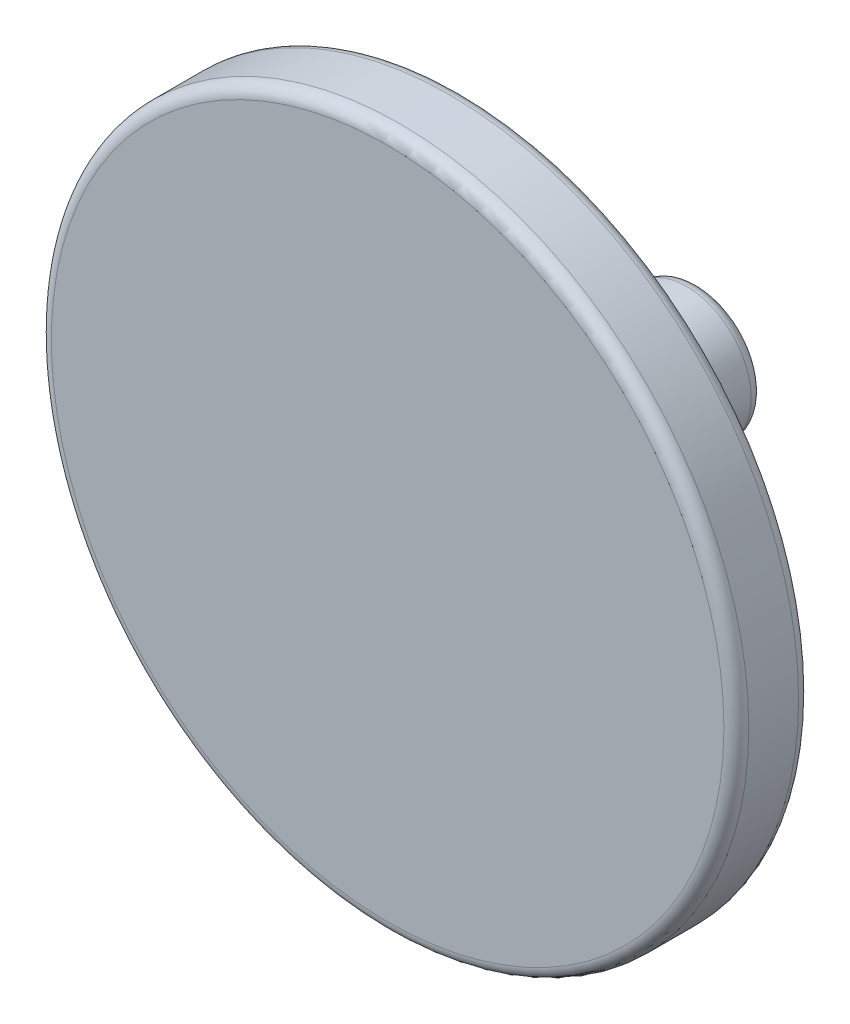
ISO-10303-21;
HEADER;
FILE_DESCRIPTION(('STEP AP214'),'2;1');
FILE_NAME('part.step','',(''),(''),'','','');
FILE_SCHEMA(('AUTOMOTIVE_DESIGN { 1 0 10303 214 1 1 1 1 }'));
ENDSEC;
DATA;
#1=APPLICATION_CONTEXT('core data for automotive mechanical design processes');
#2=APPLICATION_PROTOCOL_DEFINITION('international standard','automotive_design',2000,#1);
#3=PRODUCT_CONTEXT('',#1,'mechanical');
#4=PRODUCT('Part','Part','',(#3));
#5=PRODUCT_RELATED_PRODUCT_CATEGORY('part','',(#4));
#6=PRODUCT_DEFINITION_FORMATION('','',#4);
#7=PRODUCT_DEFINITION_CONTEXT('part definition',#1,'design');
#8=PRODUCT_DEFINITION('design','',#6,#7);
#9=PRODUCT_DEFINITION_SHAPE('','',#8);
#10=(LENGTH_UNIT() NAMED_UNIT(*) SI_UNIT(.MILLI.,.METRE.));
#11=(NAMED_UNIT(*) PLANE_ANGLE_UNIT() SI_UNIT($,.RADIAN.));
#12=(NAMED_UNIT(*) SI_UNIT($,.STERADIAN.) SOLID_ANGLE_UNIT());
#13=UNCERTAINTY_MEASURE_WITH_UNIT(LENGTH_MEASURE(1.E-05),#10,'distance_accuracy_value','');
#14=(GEOMETRIC_REPRESENTATION_CONTEXT(3) GLOBAL_UNCERTAINTY_ASSIGNED_CONTEXT((#13)) GLOBAL_UNIT_ASSIGNED_CONTEXT((#10,
#11,#12)) REPRESENTATION_CONTEXT('',''));
#15=CARTESIAN_POINT('',(0.,0.,0.));
#16=DIRECTION('',(0.,0.,1.));
#17=DIRECTION('',(1.,0.,0.));
#18=AXIS2_PLACEMENT_3D('',#15,#16,#17);
#19=CARTESIAN_POINT('',(17.35,0.,-3.));
#20=DIRECTION('',(0.,0.,1.));
#21=DIRECTION('',(1.,0.,0.));
#22=AXIS2_PLACEMENT_3D('',#19,#20,#21);
#23=CYLINDRICAL_SURFACE('',#22,3.25);
#24=CARTESIAN_POINT('',(17.35,0.,1.5));
#25=DIRECTION('',(0.,0.,1.));
#26=DIRECTION('',(1.,0.,0.));
#27=AXIS2_PLACEMENT_3D('',#24,#25,#26);
#28=CIRCLE('',#27,3.25);
#29=CARTESIAN_POINT('',(20.6,0.,1.5));
#30=VERTEX_POINT('',#29);
#31=EDGE_CURVE('E69',#30,#30,#28,.F.);
#32=ORIENTED_EDGE('',*,*,#31,.T.);
#33=EDGE_LOOP('',(#32));
#34=FACE_BOUND('',#33,.T.);
#35=CARTESIAN_POINT('',(17.35,0.,-3.));
#36=DIRECTION('',(0.,0.,1.));
#37=DIRECTION('',(1.,0.,0.));
#38=AXIS2_PLACEMENT_3D('',#35,#36,#37);
#39=CIRCLE('',#38,3.25);
#40=CARTESIAN_POINT('',(20.6,0.,-3.));
#41=VERTEX_POINT('',#40);
#42=EDGE_CURVE('E82',#41,#41,#39,.T.);
#43=ORIENTED_EDGE('',*,*,#42,.T.);
#44=EDGE_LOOP('',(#43));
#45=FACE_BOUND('',#44,.T.);
#46=ADVANCED_FACE('F41',(#34,#45),#23,.T.);
#47=CARTESIAN_POINT('',(17.35,0.,-3.));
#48=DIRECTION('',(0.,0.,1.));
#49=DIRECTION('',(1.,0.,0.));
#50=AXIS2_PLACEMENT_3D('',#47,#48,#49);
#51=PLANE('',#50);
#52=CARTESIAN_POINT('',(17.35,0.,-3.));
#53=DIRECTION('',(0.,0.,-1.));
#54=DIRECTION('',(-1.,0.,0.));
#55=AXIS2_PLACEMENT_3D('',#52,#53,#54);
#56=CIRCLE('',#55,2.6);
#57=CARTESIAN_POINT('',(14.75,0.,-3.));
#58=VERTEX_POINT('',#57);
#59=EDGE_CURVE('E81',#58,#58,#56,.T.);
#60=ORIENTED_EDGE('',*,*,#59,.F.);
#61=EDGE_LOOP('',(#60));
#62=FACE_BOUND('',#61,.T.);
#63=ORIENTED_EDGE('',*,*,#42,.F.);
#64=EDGE_LOOP('',(#63));
#65=FACE_BOUND('',#64,.T.);
#66=ADVANCED_FACE('F92',(#62,#65),#51,.F.);
#67=CARTESIAN_POINT('',(17.35,0.,5.));
#68=DIRECTION('',(0.,0.,-1.));
#69=DIRECTION('',(-1.,0.,0.));
#70=AXIS2_PLACEMENT_3D('',#67,#68,#69);
#71=CYLINDRICAL_SURFACE('',#70,14.);
#72=CARTESIAN_POINT('',(17.35,0.,4.5));
#73=DIRECTION('',(0.,0.,1.));
#74=DIRECTION('',(1.,0.,0.));
#75=AXIS2_PLACEMENT_3D('',#72,#73,#74);
#76=CIRCLE('',#75,14.);
#77=CARTESIAN_POINT('',(31.35,0.,4.5));
#78=VERTEX_POINT('',#77);
#79=EDGE_CURVE('E54',#78,#78,#76,.F.);
#80=ORIENTED_EDGE('',*,*,#79,.T.);
#81=EDGE_LOOP('',(#80));
#82=FACE_BOUND('',#81,.T.);
#83=CARTESIAN_POINT('',(17.35,0.,2.5));
#84=DIRECTION('',(0.,0.,1.));
#85=DIRECTION('',(1.,0.,0.));
#86=AXIS2_PLACEMENT_3D('',#83,#84,#85);
#87=CIRCLE('',#86,14.);
#88=CARTESIAN_POINT('',(31.35,0.,2.5));
#89=VERTEX_POINT('',#88);
#90=EDGE_CURVE('E59',#89,#89,#87,.T.);
#91=ORIENTED_EDGE('',*,*,#90,.T.);
#92=EDGE_LOOP('',(#91));
#93=FACE_BOUND('',#92,.T.);
#94=ADVANCED_FACE('F95',(#82,#93),#71,.T.);
#95=CARTESIAN_POINT('',(17.35,0.,5.));
#96=DIRECTION('',(0.,0.,1.));
#97=DIRECTION('',(1.,0.,0.));
#98=AXIS2_PLACEMENT_3D('',#95,#96,#97);
#99=PLANE('',#98);
#100=CARTESIAN_POINT('',(17.35,0.,5.));
#101=DIRECTION('',(0.,0.,1.));
#102=DIRECTION('',(1.,0.,0.));
#103=AXIS2_PLACEMENT_3D('',#100,#101,#102);
#104=CIRCLE('',#103,13.5);
#105=CARTESIAN_POINT('',(30.85,0.,5.));
#106=VERTEX_POINT('',#105);
#107=EDGE_CURVE('E65',#106,#106,#104,.T.);
#108=ORIENTED_EDGE('',*,*,#107,.T.);
#109=EDGE_LOOP('',(#108));
#110=FACE_BOUND('',#109,.T.);
#111=ADVANCED_FACE('F126',(#110),#99,.T.);
#112=CARTESIAN_POINT('',(17.35,0.,2.));
#113=DIRECTION('',(0.,0.,1.));
#114=DIRECTION('',(1.,0.,0.));
#115=AXIS2_PLACEMENT_3D('',#112,#113,#114);
#116=PLANE('',#115);
#117=CARTESIAN_POINT('',(17.35,0.,2.));
#118=DIRECTION('',(0.,0.,1.));
#119=DIRECTION('',(1.,0.,0.));
#120=AXIS2_PLACEMENT_3D('',#117,#118,#119);
#121=CIRCLE('',#120,3.75);
#122=CARTESIAN_POINT('',(21.1,0.,2.));
#123=VERTEX_POINT('',#122);
#124=EDGE_CURVE('E73',#123,#123,#121,.T.);
#125=ORIENTED_EDGE('',*,*,#124,.T.);
#126=EDGE_LOOP('',(#125));
#127=FACE_BOUND('',#126,.T.);
#128=CARTESIAN_POINT('',(17.35,0.,2.));
#129=DIRECTION('',(0.,0.,1.));
#130=DIRECTION('',(1.,0.,0.));
#131=AXIS2_PLACEMENT_3D('',#128,#129,#130);
#132=CIRCLE('',#131,13.5);
#133=CARTESIAN_POINT('',(30.85,0.,2.));
#134=VERTEX_POINT('',#133);
#135=EDGE_CURVE('E77',#134,#134,#132,.F.);
#136=ORIENTED_EDGE('',*,*,#135,.T.);
#137=EDGE_LOOP('',(#136));
#138=FACE_BOUND('',#137,.T.);
#139=ADVANCED_FACE('F131',(#127,#138),#116,.F.);
#140=CARTESIAN_POINT('',(17.35,0.,-7.5));
#141=DIRECTION('',(0.,0.,1.));
#142=DIRECTION('',(1.,0.,0.));
#143=AXIS2_PLACEMENT_3D('',#140,#141,#142);
#144=CYLINDRICAL_SURFACE('',#143,2.6);
#145=CARTESIAN_POINT('',(17.35,0.,-7.));
#146=DIRECTION('',(0.,0.,-1.));
#147=DIRECTION('',(-1.,0.,0.));
#148=AXIS2_PLACEMENT_3D('',#145,#146,#147);
#149=CIRCLE('',#148,2.6);
#150=CARTESIAN_POINT('',(14.75,0.,-7.));
#151=VERTEX_POINT('',#150);
#152=EDGE_CURVE('E10',#151,#151,#149,.F.);
#153=ORIENTED_EDGE('',*,*,#152,.T.);
#154=EDGE_LOOP('',(#153));
#155=FACE_BOUND('',#154,.T.);
#156=ORIENTED_EDGE('',*,*,#59,.T.);
#157=EDGE_LOOP('',(#156));
#158=FACE_BOUND('',#157,.T.);
#159=ADVANCED_FACE('F90',(#155,#158),#144,.T.);
#160=CARTESIAN_POINT('',(17.35,0.,-7.5));
#161=DIRECTION('',(0.,0.,-1.));
#162=DIRECTION('',(-1.,0.,0.));
#163=AXIS2_PLACEMENT_3D('',#160,#161,#162);
#164=PLANE('',#163);
#165=CARTESIAN_POINT('',(17.35,0.,-7.5));
#166=DIRECTION('',(0.,0.,-1.));
#167=DIRECTION('',(-1.,0.,0.));
#168=AXIS2_PLACEMENT_3D('',#165,#166,#167);
#169=CIRCLE('',#168,2.1);
#170=CARTESIAN_POINT('',(15.25,0.,-7.5));
#171=VERTEX_POINT('',#170);
#172=EDGE_CURVE('E49',#171,#171,#169,.T.);
#173=ORIENTED_EDGE('',*,*,#172,.T.);
#174=EDGE_LOOP('',(#173));
#175=FACE_BOUND('',#174,.T.);
#176=ADVANCED_FACE('F110',(#175),#164,.T.);
#177=CARTESIAN_POINT('',(17.35,0.,1.5));
#178=DIRECTION('',(0.,0.,1.));
#179=DIRECTION('',(1.,0.,0.));
#180=AXIS2_PLACEMENT_3D('',#177,#178,#179);
#181=TOROIDAL_SURFACE('',#180,3.75,0.5);
#182=ORIENTED_EDGE('',*,*,#31,.F.);
#183=EDGE_LOOP('',(#182));
#184=FACE_BOUND('',#183,.T.);
#185=ORIENTED_EDGE('',*,*,#124,.F.);
#186=EDGE_LOOP('',(#185));
#187=FACE_BOUND('',#186,.T.);
#188=ADVANCED_FACE('F106',(#184,#187),#181,.F.);
#189=CARTESIAN_POINT('',(17.35,0.,4.5));
#190=DIRECTION('',(0.,0.,1.));
#191=DIRECTION('',(1.,0.,0.));
#192=AXIS2_PLACEMENT_3D('',#189,#190,#191);
#193=TOROIDAL_SURFACE('',#192,13.5,0.5);
#194=ORIENTED_EDGE('',*,*,#79,.F.);
#195=EDGE_LOOP('',(#194));
#196=FACE_BOUND('',#195,.T.);
#197=ORIENTED_EDGE('',*,*,#107,.F.);
#198=EDGE_LOOP('',(#197));
#199=FACE_BOUND('',#198,.T.);
#200=ADVANCED_FACE('F109',(#196,#199),#193,.T.);
#201=CARTESIAN_POINT('',(17.35,0.,2.5));
#202=DIRECTION('',(0.,0.,1.));
#203=DIRECTION('',(1.,0.,0.));
#204=AXIS2_PLACEMENT_3D('',#201,#202,#203);
#205=TOROIDAL_SURFACE('',#204,13.5,0.5);
#206=ORIENTED_EDGE('',*,*,#135,.F.);
#207=EDGE_LOOP('',(#206));
#208=FACE_BOUND('',#207,.T.);
#209=ORIENTED_EDGE('',*,*,#90,.F.);
#210=EDGE_LOOP('',(#209));
#211=FACE_BOUND('',#210,.T.);
#212=ADVANCED_FACE('F113',(#208,#211),#205,.T.);
#213=CARTESIAN_POINT('',(17.35,0.,-7.));
#214=DIRECTION('',(0.,0.,-1.));
#215=DIRECTION('',(-1.,0.,0.));
#216=AXIS2_PLACEMENT_3D('',#213,#214,#215);
#217=TOROIDAL_SURFACE('',#216,2.1,0.5);
#218=ORIENTED_EDGE('',*,*,#152,.F.);
#219=EDGE_LOOP('',(#218));
#220=FACE_BOUND('',#219,.T.);
#221=ORIENTED_EDGE('',*,*,#172,.F.);
#222=EDGE_LOOP('',(#221));
#223=FACE_BOUND('',#222,.T.);
#224=ADVANCED_FACE('F43',(#220,#223),#217,.T.);
#225=CLOSED_SHELL('',(#46,#66,#94,#111,#139,#159,#176,#188,#200,#212,#224));
#226=MANIFOLD_SOLID_BREP('B2',#225);
#227=ADVANCED_BREP_SHAPE_REPRESENTATION('',(#18,#226),#14);
#228=SHAPE_DEFINITION_REPRESENTATION(#9,#227);
ENDSEC;
END-ISO-10303-21;
